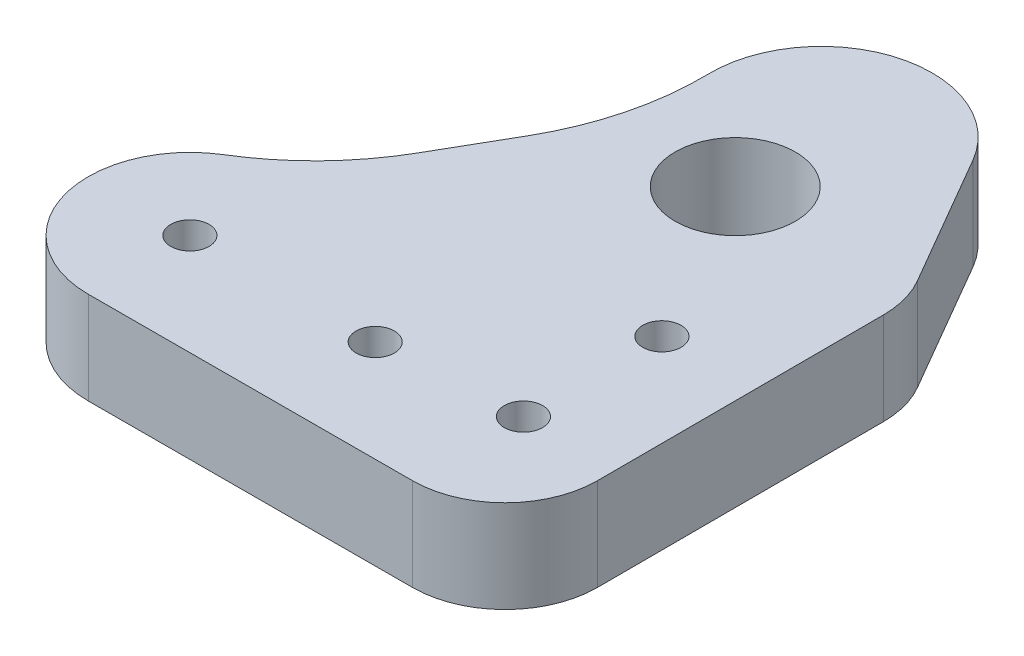
ISO-10303-21;
HEADER;
FILE_DESCRIPTION(('STEP AP214'),'2;1');
FILE_NAME('part.step','',(''),(''),'','','');
FILE_SCHEMA(('AUTOMOTIVE_DESIGN { 1 0 10303 214 1 1 1 1 }'));
ENDSEC;
DATA;
#1=APPLICATION_CONTEXT('core data for automotive mechanical design processes');
#2=APPLICATION_PROTOCOL_DEFINITION('international standard','automotive_design',2000,#1);
#3=PRODUCT_CONTEXT('',#1,'mechanical');
#4=PRODUCT('Part','Part','',(#3));
#5=PRODUCT_RELATED_PRODUCT_CATEGORY('part','',(#4));
#6=PRODUCT_DEFINITION_FORMATION('','',#4);
#7=PRODUCT_DEFINITION_CONTEXT('part definition',#1,'design');
#8=PRODUCT_DEFINITION('design','',#6,#7);
#9=PRODUCT_DEFINITION_SHAPE('','',#8);
#10=(LENGTH_UNIT() NAMED_UNIT(*) SI_UNIT(.MILLI.,.METRE.));
#11=(NAMED_UNIT(*) PLANE_ANGLE_UNIT() SI_UNIT($,.RADIAN.));
#12=(NAMED_UNIT(*) SI_UNIT($,.STERADIAN.) SOLID_ANGLE_UNIT());
#13=UNCERTAINTY_MEASURE_WITH_UNIT(LENGTH_MEASURE(1.E-05),#10,'distance_accuracy_value','');
#14=(GEOMETRIC_REPRESENTATION_CONTEXT(3) GLOBAL_UNCERTAINTY_ASSIGNED_CONTEXT((#13)) GLOBAL_UNIT_ASSIGNED_CONTEXT((#10,
#11,#12)) REPRESENTATION_CONTEXT('',''));
#15=CARTESIAN_POINT('',(0.,0.,0.));
#16=DIRECTION('',(0.,0.,1.));
#17=DIRECTION('',(1.,0.,0.));
#18=AXIS2_PLACEMENT_3D('',#15,#16,#17);
#19=CARTESIAN_POINT('',(13.7035202228936,10.,15.1722366317874));
#20=DIRECTION('',(0.,1.,0.));
#21=DIRECTION('',(0.,0.,1.));
#22=AXIS2_PLACEMENT_3D('',#19,#20,#21);
#23=PLANE('',#22);
#24=CARTESIAN_POINT('',(13.669804265512,10.,-1.82772993567193));
#25=DIRECTION('',(0.,1.,0.));
#26=DIRECTION('',(0.,0.,1.));
#27=AXIS2_PLACEMENT_3D('',#24,#25,#26);
#28=CIRCLE('',#27,2.06999999999918);
#29=CARTESIAN_POINT('',(13.669804265512,10.,0.24227006432725));
#30=VERTEX_POINT('',#29);
#31=EDGE_CURVE('E230',#30,#30,#28,.T.);
#32=ORIENTED_EDGE('',*,*,#31,.F.);
#33=EDGE_LOOP('',(#32));
#34=FACE_BOUND('',#33,.T.);
#35=CARTESIAN_POINT('',(-1.29843356784781,10.,14.201987970891));
#36=DIRECTION('',(0.,1.,0.));
#37=DIRECTION('',(0.,0.,1.));
#38=AXIS2_PLACEMENT_3D('',#35,#36,#37);
#39=CIRCLE('',#38,2.06999999999918);
#40=CARTESIAN_POINT('',(-1.29843356784781,10.,16.2719879708901));
#41=VERTEX_POINT('',#40);
#42=EDGE_CURVE('E218',#41,#41,#39,.T.);
#43=ORIENTED_EDGE('',*,*,#42,.F.);
#44=EDGE_LOOP('',(#43));
#45=FACE_BOUND('',#44,.T.);
#46=CARTESIAN_POINT('',(13.7035202228936,10.,15.1722366317874));
#47=DIRECTION('',(0.,1.,0.));
#48=DIRECTION('',(0.,0.,1.));
#49=AXIS2_PLACEMENT_3D('',#46,#47,#48);
#50=CIRCLE('',#49,10.0000000000019);
#51=CARTESIAN_POINT('',(13.7233531389994,10.,25.1722169645419));
#52=VERTEX_POINT('',#51);
#53=CARTESIAN_POINT('',(23.7035005556481,10.,15.1524037156816));
#54=VERTEX_POINT('',#53);
#55=EDGE_CURVE('E167',#52,#54,#50,.T.);
#56=ORIENTED_EDGE('',*,*,#55,.T.);
#57=DIRECTION('',(-0.00198329161057877,0.,-0.99999803327526));
#58=VECTOR('',#57,1.);
#59=CARTESIAN_POINT('',(23.7035005556481,10.,15.1524037156816));
#60=LINE('',#59,#58);
#61=CARTESIAN_POINT('',(23.6420566700554,10.,-15.8282974690378));
#62=VERTEX_POINT('',#61);
#63=EDGE_CURVE('E105',#54,#62,#60,.T.);
#64=ORIENTED_EDGE('',*,*,#63,.T.);
#65=CARTESIAN_POINT('',(13.6420763373009,10.,-15.808464552932));
#66=DIRECTION('',(0.,1.,0.));
#67=DIRECTION('',(0.,0.,1.));
#68=AXIS2_PLACEMENT_3D('',#65,#66,#67);
#69=CIRCLE('',#68,10.0000000000019);
#70=CARTESIAN_POINT('',(22.292396884758,10.,-20.8256305284882));
#71=VERTEX_POINT('',#70);
#72=EDGE_CURVE('E188',#62,#71,#69,.T.);
#73=ORIENTED_EDGE('',*,*,#72,.T.);
#74=DIRECTION('',(-0.501716597555529,0.,-0.865032054745547));
#75=VECTOR('',#74,1.);
#76=CARTESIAN_POINT('',(22.292396884758,10.,-20.8256305284882));
#77=LINE('',#76,#75);
#78=CARTESIAN_POINT('',(13.9960622095919,10.,-35.1297126853903));
#79=VERTEX_POINT('',#78);
#80=EDGE_CURVE('E207',#71,#79,#77,.T.);
#81=ORIENTED_EDGE('',*,*,#80,.T.);
#82=CARTESIAN_POINT('',(3.6156775526455,10.,-29.1091135147241));
#83=DIRECTION('',(0.,1.,0.));
#84=DIRECTION('',(0.,0.,1.));
#85=AXIS2_PLACEMENT_3D('',#82,#83,#84);
#86=CIRCLE('',#85,11.9999999999998);
#87=CARTESIAN_POINT('',(-8.38204475175919,10.,-28.8753197885769));
#88=VERTEX_POINT('',#87);
#89=EDGE_CURVE('E204',#79,#88,#86,.T.);
#90=ORIENTED_EDGE('',*,*,#89,.T.);
#91=CARTESIAN_POINT('',(-38.3763505127776,10.,-28.2908354732088));
#92=DIRECTION('',(0.,-1.,0.));
#93=DIRECTION('',(0.,0.,1.));
#94=AXIS2_PLACEMENT_3D('',#91,#92,#93);
#95=CIRCLE('',#94,30.0000000000062);
#96=CARTESIAN_POINT('',(-12.3658901209037,10.,-13.3423924036737));
#97=VERTEX_POINT('',#96);
#98=EDGE_CURVE('E206',#88,#97,#95,.T.);
#99=ORIENTED_EDGE('',*,*,#98,.T.);
#100=DIRECTION('',(-0.498281435651068,0.,0.867015346395617));
#101=VECTOR('',#100,1.);
#102=CARTESIAN_POINT('',(-12.3658901209037,10.,-13.3423924036737));
#103=LINE('',#102,#101);
#104=CARTESIAN_POINT('',(-16.7234985412879,10.,-5.76010435571691));
#105=VERTEX_POINT('',#104);
#106=EDGE_CURVE('E130',#97,#105,#103,.T.);
#107=ORIENTED_EDGE('',*,*,#106,.T.);
#108=CARTESIAN_POINT('',(-42.7339589331618,10.,-20.708547425252));
#109=DIRECTION('',(0.,-1.,0.));
#110=DIRECTION('',(0.,0.,1.));
#111=AXIS2_PLACEMENT_3D('',#108,#109,#110);
#112=CIRCLE('',#111,30.0000000000062);
#113=CARTESIAN_POINT('',(-27.0493993971641,10.,4.86477054802078));
#114=VERTEX_POINT('',#113);
#115=EDGE_CURVE('E124',#105,#114,#112,.T.);
#116=ORIENTED_EDGE('',*,*,#115,.T.);
#117=CARTESIAN_POINT('',(-21.2983942339661,10.,14.2416538048855));
#118=DIRECTION('',(0.,1.,0.));
#119=DIRECTION('',(0.,0.,1.));
#120=AXIS2_PLACEMENT_3D('',#117,#118,#119);
#121=CIRCLE('',#120,11.);
#122=CARTESIAN_POINT('',(-21.2765780262498,10.,25.2416321709134));
#123=VERTEX_POINT('',#122);
#124=EDGE_CURVE('E128',#114,#123,#121,.T.);
#125=ORIENTED_EDGE('',*,*,#124,.T.);
#126=DIRECTION('',(0.99999803327526,0.,-0.00198329161057773));
#127=VECTOR('',#126,1.);
#128=CARTESIAN_POINT('',(-21.2765780262498,10.,25.2416321709134));
#129=LINE('',#128,#127);
#130=EDGE_CURVE('E56',#123,#52,#129,.T.);
#131=ORIENTED_EDGE('',*,*,#130,.T.);
#132=EDGE_LOOP('',(#56,#64,#73,#81,#90,#99,#107,#116,#125,#131));
#133=FACE_BOUND('',#132,.T.);
#134=CARTESIAN_POINT('',(-21.2983942339661,10.,14.2416538048855));
#135=DIRECTION('',(0.,1.,0.));
#136=DIRECTION('',(0.,0.,1.));
#137=AXIS2_PLACEMENT_3D('',#134,#135,#136);
#138=CIRCLE('',#137,2.07000000110677);
#139=CARTESIAN_POINT('',(-21.2983942339661,10.,16.3116538059923));
#140=VERTEX_POINT('',#139);
#141=EDGE_CURVE('E152',#140,#140,#138,.T.);
#142=ORIENTED_EDGE('',*,*,#141,.F.);
#143=EDGE_LOOP('',(#142));
#144=FACE_BOUND('',#143,.T.);
#145=CARTESIAN_POINT('',(13.6995536396707,10.,13.1722405634571));
#146=DIRECTION('',(0.,1.,0.));
#147=DIRECTION('',(0.,0.,1.));
#148=AXIS2_PLACEMENT_3D('',#145,#146,#147);
#149=CIRCLE('',#148,2.06999999999911);
#150=CARTESIAN_POINT('',(13.6995536396707,10.,15.2422405634562));
#151=VERTEX_POINT('',#150);
#152=EDGE_CURVE('E224',#151,#151,#149,.T.);
#153=ORIENTED_EDGE('',*,*,#152,.F.);
#154=EDGE_LOOP('',(#153));
#155=FACE_BOUND('',#154,.T.);
#156=CARTESIAN_POINT('',(3.6156775526455,10.,-19.8078250306266));
#157=DIRECTION('',(0.,1.,0.));
#158=DIRECTION('',(0.,0.,1.));
#159=AXIS2_PLACEMENT_3D('',#156,#157,#158);
#160=CIRCLE('',#159,6.4999999999994);
#161=CARTESIAN_POINT('',(3.6156775526455,10.,-13.3078250306272));
#162=VERTEX_POINT('',#161);
#163=EDGE_CURVE('E236',#162,#162,#160,.T.);
#164=ORIENTED_EDGE('',*,*,#163,.F.);
#165=EDGE_LOOP('',(#164));
#166=FACE_BOUND('',#165,.T.);
#167=ADVANCED_FACE('F39',(#34,#45,#133,#144,#155,#166),#23,.T.);
#168=CARTESIAN_POINT('',(13.7035202228936,0.,15.1722366317874));
#169=DIRECTION('',(0.,1.,0.));
#170=DIRECTION('',(0.,0.,1.));
#171=AXIS2_PLACEMENT_3D('',#168,#169,#170);
#172=PLANE('',#171);
#173=CARTESIAN_POINT('',(13.7035202228936,0.,15.1722366317874));
#174=DIRECTION('',(0.,1.,0.));
#175=DIRECTION('',(0.,0.,1.));
#176=AXIS2_PLACEMENT_3D('',#173,#174,#175);
#177=CIRCLE('',#176,10.0000000000019);
#178=CARTESIAN_POINT('',(13.7233531389994,0.,25.1722169645419));
#179=VERTEX_POINT('',#178);
#180=CARTESIAN_POINT('',(23.7035005556481,0.,15.1524037156816));
#181=VERTEX_POINT('',#180);
#182=EDGE_CURVE('E148',#179,#181,#177,.T.);
#183=ORIENTED_EDGE('',*,*,#182,.F.);
#184=DIRECTION('',(0.99999803327526,0.,-0.00198329161057773));
#185=VECTOR('',#184,1.);
#186=CARTESIAN_POINT('',(-21.2765780262498,0.,25.2416321709134));
#187=LINE('',#186,#185);
#188=CARTESIAN_POINT('',(-21.2765780262498,0.,25.2416321709134));
#189=VERTEX_POINT('',#188);
#190=EDGE_CURVE('E97',#189,#179,#187,.T.);
#191=ORIENTED_EDGE('',*,*,#190,.F.);
#192=CARTESIAN_POINT('',(-21.2983942339661,0.,14.2416538048855));
#193=DIRECTION('',(0.,1.,0.));
#194=DIRECTION('',(0.,0.,1.));
#195=AXIS2_PLACEMENT_3D('',#192,#193,#194);
#196=CIRCLE('',#195,11.);
#197=CARTESIAN_POINT('',(-27.0493993971641,0.,4.86477054802078));
#198=VERTEX_POINT('',#197);
#199=EDGE_CURVE('E91',#198,#189,#196,.T.);
#200=ORIENTED_EDGE('',*,*,#199,.F.);
#201=CARTESIAN_POINT('',(-42.7339589331618,0.,-20.708547425252));
#202=DIRECTION('',(0.,-1.,0.));
#203=DIRECTION('',(0.,0.,1.));
#204=AXIS2_PLACEMENT_3D('',#201,#202,#203);
#205=CIRCLE('',#204,30.0000000000062);
#206=CARTESIAN_POINT('',(-16.7234985412879,0.,-5.76010435571691));
#207=VERTEX_POINT('',#206);
#208=EDGE_CURVE('E138',#207,#198,#205,.T.);
#209=ORIENTED_EDGE('',*,*,#208,.F.);
#210=DIRECTION('',(-0.498281435651068,0.,0.867015346395617));
#211=VECTOR('',#210,1.);
#212=CARTESIAN_POINT('',(-12.3658901209037,0.,-13.3423924036737));
#213=LINE('',#212,#211);
#214=CARTESIAN_POINT('',(-12.3658901209037,0.,-13.3423924036737));
#215=VERTEX_POINT('',#214);
#216=EDGE_CURVE('E162',#215,#207,#213,.T.);
#217=ORIENTED_EDGE('',*,*,#216,.F.);
#218=CARTESIAN_POINT('',(-38.3763505127776,0.,-28.2908354732088));
#219=DIRECTION('',(0.,-1.,0.));
#220=DIRECTION('',(0.,0.,1.));
#221=AXIS2_PLACEMENT_3D('',#218,#219,#220);
#222=CIRCLE('',#221,30.0000000000062);
#223=CARTESIAN_POINT('',(-8.38204475175919,0.,-28.8753197885769));
#224=VERTEX_POINT('',#223);
#225=EDGE_CURVE('E160',#224,#215,#222,.T.);
#226=ORIENTED_EDGE('',*,*,#225,.F.);
#227=CARTESIAN_POINT('',(3.6156775526455,0.,-29.1091135147241));
#228=DIRECTION('',(0.,1.,0.));
#229=DIRECTION('',(0.,0.,1.));
#230=AXIS2_PLACEMENT_3D('',#227,#228,#229);
#231=CIRCLE('',#230,11.9999999999998);
#232=CARTESIAN_POINT('',(13.9960622095919,0.,-35.1297126853903));
#233=VERTEX_POINT('',#232);
#234=EDGE_CURVE('E158',#233,#224,#231,.T.);
#235=ORIENTED_EDGE('',*,*,#234,.F.);
#236=DIRECTION('',(-0.501716597555529,0.,-0.865032054745547));
#237=VECTOR('',#236,1.);
#238=CARTESIAN_POINT('',(22.292396884758,0.,-20.8256305284882));
#239=LINE('',#238,#237);
#240=CARTESIAN_POINT('',(22.292396884758,0.,-20.8256305284882));
#241=VERTEX_POINT('',#240);
#242=EDGE_CURVE('E156',#241,#233,#239,.T.);
#243=ORIENTED_EDGE('',*,*,#242,.F.);
#244=CARTESIAN_POINT('',(13.6420763373009,0.,-15.808464552932));
#245=DIRECTION('',(0.,1.,0.));
#246=DIRECTION('',(0.,0.,1.));
#247=AXIS2_PLACEMENT_3D('',#244,#245,#246);
#248=CIRCLE('',#247,10.0000000000019);
#249=CARTESIAN_POINT('',(23.6420566700554,0.,-15.8282974690378));
#250=VERTEX_POINT('',#249);
#251=EDGE_CURVE('E154',#250,#241,#248,.T.);
#252=ORIENTED_EDGE('',*,*,#251,.F.);
#253=DIRECTION('',(-0.00198329161057877,0.,-0.99999803327526));
#254=VECTOR('',#253,1.);
#255=CARTESIAN_POINT('',(23.7035005556481,0.,15.1524037156816));
#256=LINE('',#255,#254);
#257=EDGE_CURVE('E151',#181,#250,#256,.T.);
#258=ORIENTED_EDGE('',*,*,#257,.F.);
#259=EDGE_LOOP('',(#183,#191,#200,#209,#217,#226,#235,#243,#252,#258));
#260=FACE_BOUND('',#259,.T.);
#261=CARTESIAN_POINT('',(-21.2983942339661,0.,14.2416538048855));
#262=DIRECTION('',(0.,1.,0.));
#263=DIRECTION('',(0.,0.,1.));
#264=AXIS2_PLACEMENT_3D('',#261,#262,#263);
#265=CIRCLE('',#264,2.07000000110677);
#266=CARTESIAN_POINT('',(-21.2983942339661,0.,16.3116538059923));
#267=VERTEX_POINT('',#266);
#268=EDGE_CURVE('E215',#267,#267,#265,.T.);
#269=ORIENTED_EDGE('',*,*,#268,.T.);
#270=EDGE_LOOP('',(#269));
#271=FACE_BOUND('',#270,.T.);
#272=CARTESIAN_POINT('',(-1.29843356784781,0.,14.201987970891));
#273=DIRECTION('',(0.,1.,0.));
#274=DIRECTION('',(0.,0.,1.));
#275=AXIS2_PLACEMENT_3D('',#272,#273,#274);
#276=CIRCLE('',#275,2.06999999999918);
#277=CARTESIAN_POINT('',(-1.29843356784781,0.,16.2719879708901));
#278=VERTEX_POINT('',#277);
#279=EDGE_CURVE('E221',#278,#278,#276,.T.);
#280=ORIENTED_EDGE('',*,*,#279,.T.);
#281=EDGE_LOOP('',(#280));
#282=FACE_BOUND('',#281,.T.);
#283=CARTESIAN_POINT('',(13.6995536396707,0.,13.1722405634571));
#284=DIRECTION('',(0.,1.,0.));
#285=DIRECTION('',(0.,0.,1.));
#286=AXIS2_PLACEMENT_3D('',#283,#284,#285);
#287=CIRCLE('',#286,2.06999999999911);
#288=CARTESIAN_POINT('',(13.6995536396707,0.,15.2422405634562));
#289=VERTEX_POINT('',#288);
#290=EDGE_CURVE('E227',#289,#289,#287,.T.);
#291=ORIENTED_EDGE('',*,*,#290,.T.);
#292=EDGE_LOOP('',(#291));
#293=FACE_BOUND('',#292,.T.);
#294=CARTESIAN_POINT('',(13.669804265512,0.,-1.82772993567193));
#295=DIRECTION('',(0.,1.,0.));
#296=DIRECTION('',(0.,0.,1.));
#297=AXIS2_PLACEMENT_3D('',#294,#295,#296);
#298=CIRCLE('',#297,2.06999999999918);
#299=CARTESIAN_POINT('',(13.669804265512,0.,0.24227006432725));
#300=VERTEX_POINT('',#299);
#301=EDGE_CURVE('E233',#300,#300,#298,.T.);
#302=ORIENTED_EDGE('',*,*,#301,.T.);
#303=EDGE_LOOP('',(#302));
#304=FACE_BOUND('',#303,.T.);
#305=CARTESIAN_POINT('',(3.6156775526455,0.,-19.8078250306266));
#306=DIRECTION('',(0.,1.,0.));
#307=DIRECTION('',(0.,0.,1.));
#308=AXIS2_PLACEMENT_3D('',#305,#306,#307);
#309=CIRCLE('',#308,6.4999999999994);
#310=CARTESIAN_POINT('',(3.6156775526455,0.,-13.3078250306272));
#311=VERTEX_POINT('',#310);
#312=EDGE_CURVE('E239',#311,#311,#309,.T.);
#313=ORIENTED_EDGE('',*,*,#312,.T.);
#314=EDGE_LOOP('',(#313));
#315=FACE_BOUND('',#314,.T.);
#316=ADVANCED_FACE('F192',(#260,#271,#282,#293,#304,#315),#172,.F.);
#317=CARTESIAN_POINT('',(13.7035202228936,10.,15.1722366317874));
#318=DIRECTION('',(0.,-1.,0.));
#319=DIRECTION('',(0.,0.,-1.));
#320=AXIS2_PLACEMENT_3D('',#317,#318,#319);
#321=CYLINDRICAL_SURFACE('',#320,10.0000000000019);
#322=ORIENTED_EDGE('',*,*,#182,.T.);
#323=DIRECTION('',(0.,-1.,0.));
#324=VECTOR('',#323,1.);
#325=CARTESIAN_POINT('',(23.7035005556481,10.,15.1524037156816));
#326=LINE('',#325,#324);
#327=EDGE_CURVE('E11',#54,#181,#326,.T.);
#328=ORIENTED_EDGE('',*,*,#327,.F.);
#329=ORIENTED_EDGE('',*,*,#55,.F.);
#330=DIRECTION('',(0.,-1.,0.));
#331=VECTOR('',#330,1.);
#332=CARTESIAN_POINT('',(13.7233531389994,10.,25.1722169645419));
#333=LINE('',#332,#331);
#334=EDGE_CURVE('E144',#52,#179,#333,.T.);
#335=ORIENTED_EDGE('',*,*,#334,.T.);
#336=EDGE_LOOP('',(#322,#328,#329,#335));
#337=FACE_BOUND('',#336,.T.);
#338=ADVANCED_FACE('F41',(#337),#321,.T.);
#339=CARTESIAN_POINT('',(23.7035005556481,10.,15.1524037156816));
#340=DIRECTION('',(-0.99999803327526,0.,0.00198329161057877));
#341=DIRECTION('',(0.00198329161057877,0.,0.99999803327526));
#342=AXIS2_PLACEMENT_3D('',#339,#340,#341);
#343=PLANE('',#342);
#344=ORIENTED_EDGE('',*,*,#257,.T.);
#345=DIRECTION('',(0.,-1.,0.));
#346=VECTOR('',#345,1.);
#347=CARTESIAN_POINT('',(23.6420566700554,10.,-15.8282974690378));
#348=LINE('',#347,#346);
#349=EDGE_CURVE('E48',#62,#250,#348,.T.);
#350=ORIENTED_EDGE('',*,*,#349,.F.);
#351=ORIENTED_EDGE('',*,*,#63,.F.);
#352=ORIENTED_EDGE('',*,*,#327,.T.);
#353=EDGE_LOOP('',(#344,#350,#351,#352));
#354=FACE_BOUND('',#353,.T.);
#355=ADVANCED_FACE('F281',(#354),#343,.F.);
#356=CARTESIAN_POINT('',(13.6420763373009,10.,-15.808464552932));
#357=DIRECTION('',(0.,-1.,0.));
#358=DIRECTION('',(0.,0.,-1.));
#359=AXIS2_PLACEMENT_3D('',#356,#357,#358);
#360=CYLINDRICAL_SURFACE('',#359,10.0000000000019);
#361=ORIENTED_EDGE('',*,*,#251,.T.);
#362=DIRECTION('',(0.,-1.,0.));
#363=VECTOR('',#362,1.);
#364=CARTESIAN_POINT('',(22.292396884758,10.,-20.8256305284882));
#365=LINE('',#364,#363);
#366=EDGE_CURVE('E180',#71,#241,#365,.T.);
#367=ORIENTED_EDGE('',*,*,#366,.F.);
#368=ORIENTED_EDGE('',*,*,#72,.F.);
#369=ORIENTED_EDGE('',*,*,#349,.T.);
#370=EDGE_LOOP('',(#361,#367,#368,#369));
#371=FACE_BOUND('',#370,.T.);
#372=ADVANCED_FACE('F186',(#371),#360,.T.);
#373=CARTESIAN_POINT('',(22.292396884758,10.,-20.8256305284882));
#374=DIRECTION('',(-0.865032054745547,0.,0.501716597555529));
#375=DIRECTION('',(0.501716597555529,0.,0.865032054745547));
#376=AXIS2_PLACEMENT_3D('',#373,#374,#375);
#377=PLANE('',#376);
#378=ORIENTED_EDGE('',*,*,#242,.T.);
#379=DIRECTION('',(0.,-1.,0.));
#380=VECTOR('',#379,1.);
#381=CARTESIAN_POINT('',(13.9960622095919,10.,-35.1297126853903));
#382=LINE('',#381,#380);
#383=EDGE_CURVE('E177',#79,#233,#382,.T.);
#384=ORIENTED_EDGE('',*,*,#383,.F.);
#385=ORIENTED_EDGE('',*,*,#80,.F.);
#386=ORIENTED_EDGE('',*,*,#366,.T.);
#387=EDGE_LOOP('',(#378,#384,#385,#386));
#388=FACE_BOUND('',#387,.T.);
#389=ADVANCED_FACE('F198',(#388),#377,.F.);
#390=CARTESIAN_POINT('',(3.6156775526455,10.,-29.1091135147241));
#391=DIRECTION('',(0.,-1.,0.));
#392=DIRECTION('',(0.,0.,-1.));
#393=AXIS2_PLACEMENT_3D('',#390,#391,#392);
#394=CYLINDRICAL_SURFACE('',#393,11.9999999999998);
#395=ORIENTED_EDGE('',*,*,#234,.T.);
#396=DIRECTION('',(0.,-1.,0.));
#397=VECTOR('',#396,1.);
#398=CARTESIAN_POINT('',(-8.38204475175919,10.,-28.8753197885769));
#399=LINE('',#398,#397);
#400=EDGE_CURVE('E174',#88,#224,#399,.T.);
#401=ORIENTED_EDGE('',*,*,#400,.F.);
#402=ORIENTED_EDGE('',*,*,#89,.F.);
#403=ORIENTED_EDGE('',*,*,#383,.T.);
#404=EDGE_LOOP('',(#395,#401,#402,#403));
#405=FACE_BOUND('',#404,.T.);
#406=ADVANCED_FACE('F202',(#405),#394,.T.);
#407=CARTESIAN_POINT('',(-38.3763505127776,10.,-28.2908354732088));
#408=DIRECTION('',(0.,-1.,0.));
#409=DIRECTION('',(0.,0.,-1.));
#410=AXIS2_PLACEMENT_3D('',#407,#408,#409);
#411=CYLINDRICAL_SURFACE('',#410,30.0000000000062);
#412=ORIENTED_EDGE('',*,*,#225,.T.);
#413=DIRECTION('',(0.,-1.,0.));
#414=VECTOR('',#413,1.);
#415=CARTESIAN_POINT('',(-12.3658901209037,10.,-13.3423924036737));
#416=LINE('',#415,#414);
#417=EDGE_CURVE('E171',#97,#215,#416,.T.);
#418=ORIENTED_EDGE('',*,*,#417,.F.);
#419=ORIENTED_EDGE('',*,*,#98,.F.);
#420=ORIENTED_EDGE('',*,*,#400,.T.);
#421=EDGE_LOOP('',(#412,#418,#419,#420));
#422=FACE_BOUND('',#421,.T.);
#423=ADVANCED_FACE('F271',(#422),#411,.F.);
#424=CARTESIAN_POINT('',(-12.3658901209037,10.,-13.3423924036737));
#425=DIRECTION('',(0.867015346395617,0.,0.498281435651068));
#426=DIRECTION('',(0.498281435651068,0.,-0.867015346395617));
#427=AXIS2_PLACEMENT_3D('',#424,#425,#426);
#428=PLANE('',#427);
#429=ORIENTED_EDGE('',*,*,#216,.T.);
#430=DIRECTION('',(0.,-1.,0.));
#431=VECTOR('',#430,1.);
#432=CARTESIAN_POINT('',(-16.7234985412879,10.,-5.76010435571691));
#433=LINE('',#432,#431);
#434=EDGE_CURVE('E139',#105,#207,#433,.T.);
#435=ORIENTED_EDGE('',*,*,#434,.F.);
#436=ORIENTED_EDGE('',*,*,#106,.F.);
#437=ORIENTED_EDGE('',*,*,#417,.T.);
#438=EDGE_LOOP('',(#429,#435,#436,#437));
#439=FACE_BOUND('',#438,.T.);
#440=ADVANCED_FACE('F268',(#439),#428,.F.);
#441=CARTESIAN_POINT('',(-42.7339589331618,10.,-20.708547425252));
#442=DIRECTION('',(0.,-1.,0.));
#443=DIRECTION('',(0.,0.,-1.));
#444=AXIS2_PLACEMENT_3D('',#441,#442,#443);
#445=CYLINDRICAL_SURFACE('',#444,30.0000000000062);
#446=ORIENTED_EDGE('',*,*,#208,.T.);
#447=DIRECTION('',(0.,-1.,0.));
#448=VECTOR('',#447,1.);
#449=CARTESIAN_POINT('',(-27.0493993971641,10.,4.86477054802078));
#450=LINE('',#449,#448);
#451=EDGE_CURVE('E135',#114,#198,#450,.T.);
#452=ORIENTED_EDGE('',*,*,#451,.F.);
#453=ORIENTED_EDGE('',*,*,#115,.F.);
#454=ORIENTED_EDGE('',*,*,#434,.T.);
#455=EDGE_LOOP('',(#446,#452,#453,#454));
#456=FACE_BOUND('',#455,.T.);
#457=ADVANCED_FACE('F136',(#456),#445,.F.);
#458=CARTESIAN_POINT('',(-21.2983942339661,10.,14.2416538048855));
#459=DIRECTION('',(0.,-1.,0.));
#460=DIRECTION('',(0.,0.,-1.));
#461=AXIS2_PLACEMENT_3D('',#458,#459,#460);
#462=CYLINDRICAL_SURFACE('',#461,11.);
#463=ORIENTED_EDGE('',*,*,#199,.T.);
#464=DIRECTION('',(0.,-1.,0.));
#465=VECTOR('',#464,1.);
#466=CARTESIAN_POINT('',(-21.2765780262498,10.,25.2416321709134));
#467=LINE('',#466,#465);
#468=EDGE_CURVE('E140',#123,#189,#467,.T.);
#469=ORIENTED_EDGE('',*,*,#468,.F.);
#470=ORIENTED_EDGE('',*,*,#124,.F.);
#471=ORIENTED_EDGE('',*,*,#451,.T.);
#472=EDGE_LOOP('',(#463,#469,#470,#471));
#473=FACE_BOUND('',#472,.T.);
#474=ADVANCED_FACE('F142',(#473),#462,.T.);
#475=CARTESIAN_POINT('',(-21.2765780262498,10.,25.2416321709134));
#476=DIRECTION('',(-0.00198329161057773,0.,-0.99999803327526));
#477=DIRECTION('',(-0.99999803327526,0.,0.00198329161057773));
#478=AXIS2_PLACEMENT_3D('',#475,#476,#477);
#479=PLANE('',#478);
#480=ORIENTED_EDGE('',*,*,#190,.T.);
#481=ORIENTED_EDGE('',*,*,#334,.F.);
#482=ORIENTED_EDGE('',*,*,#130,.F.);
#483=ORIENTED_EDGE('',*,*,#468,.T.);
#484=EDGE_LOOP('',(#480,#481,#482,#483));
#485=FACE_BOUND('',#484,.T.);
#486=ADVANCED_FACE('F261',(#485),#479,.F.);
#487=CARTESIAN_POINT('',(-21.2983942339661,10.,14.2416538048855));
#488=DIRECTION('',(0.,-1.,0.));
#489=DIRECTION('',(0.,0.,-1.));
#490=AXIS2_PLACEMENT_3D('',#487,#488,#489);
#491=CYLINDRICAL_SURFACE('',#490,2.07000000110677);
#492=ORIENTED_EDGE('',*,*,#141,.T.);
#493=EDGE_LOOP('',(#492));
#494=FACE_BOUND('',#493,.T.);
#495=ORIENTED_EDGE('',*,*,#268,.F.);
#496=EDGE_LOOP('',(#495));
#497=FACE_BOUND('',#496,.T.);
#498=ADVANCED_FACE('F258',(#494,#497),#491,.F.);
#499=CARTESIAN_POINT('',(-1.29843356784781,10.,14.201987970891));
#500=DIRECTION('',(0.,-1.,0.));
#501=DIRECTION('',(0.,0.,-1.));
#502=AXIS2_PLACEMENT_3D('',#499,#500,#501);
#503=CYLINDRICAL_SURFACE('',#502,2.06999999999918);
#504=ORIENTED_EDGE('',*,*,#42,.T.);
#505=EDGE_LOOP('',(#504));
#506=FACE_BOUND('',#505,.T.);
#507=ORIENTED_EDGE('',*,*,#279,.F.);
#508=EDGE_LOOP('',(#507));
#509=FACE_BOUND('',#508,.T.);
#510=ADVANCED_FACE('F357',(#506,#509),#503,.F.);
#511=CARTESIAN_POINT('',(13.6995536396707,10.,13.1722405634571));
#512=DIRECTION('',(0.,-1.,0.));
#513=DIRECTION('',(0.,0.,-1.));
#514=AXIS2_PLACEMENT_3D('',#511,#512,#513);
#515=CYLINDRICAL_SURFACE('',#514,2.06999999999911);
#516=ORIENTED_EDGE('',*,*,#152,.T.);
#517=EDGE_LOOP('',(#516));
#518=FACE_BOUND('',#517,.T.);
#519=ORIENTED_EDGE('',*,*,#290,.F.);
#520=EDGE_LOOP('',(#519));
#521=FACE_BOUND('',#520,.T.);
#522=ADVANCED_FACE('F365',(#518,#521),#515,.F.);
#523=CARTESIAN_POINT('',(13.669804265512,10.,-1.82772993567193));
#524=DIRECTION('',(0.,-1.,0.));
#525=DIRECTION('',(0.,0.,-1.));
#526=AXIS2_PLACEMENT_3D('',#523,#524,#525);
#527=CYLINDRICAL_SURFACE('',#526,2.06999999999918);
#528=ORIENTED_EDGE('',*,*,#31,.T.);
#529=EDGE_LOOP('',(#528));
#530=FACE_BOUND('',#529,.T.);
#531=ORIENTED_EDGE('',*,*,#301,.F.);
#532=EDGE_LOOP('',(#531));
#533=FACE_BOUND('',#532,.T.);
#534=ADVANCED_FACE('F373',(#530,#533),#527,.F.);
#535=CARTESIAN_POINT('',(3.6156775526455,10.,-19.8078250306266));
#536=DIRECTION('',(0.,-1.,0.));
#537=DIRECTION('',(0.,0.,-1.));
#538=AXIS2_PLACEMENT_3D('',#535,#536,#537);
#539=CYLINDRICAL_SURFACE('',#538,6.4999999999994);
#540=ORIENTED_EDGE('',*,*,#163,.T.);
#541=EDGE_LOOP('',(#540));
#542=FACE_BOUND('',#541,.T.);
#543=ORIENTED_EDGE('',*,*,#312,.F.);
#544=EDGE_LOOP('',(#543));
#545=FACE_BOUND('',#544,.T.);
#546=ADVANCED_FACE('F245',(#542,#545),#539,.F.);
#547=CLOSED_SHELL('',(#167,#316,#338,#355,#372,#389,#406,#423,#440,#457,#474,#486,#498,#510,
#522,#534,#546));
#548=MANIFOLD_SOLID_BREP('B2',#547);
#549=ADVANCED_BREP_SHAPE_REPRESENTATION('',(#18,#548),#14);
#550=SHAPE_DEFINITION_REPRESENTATION(#9,#549);
ENDSEC;
END-ISO-10303-21;
